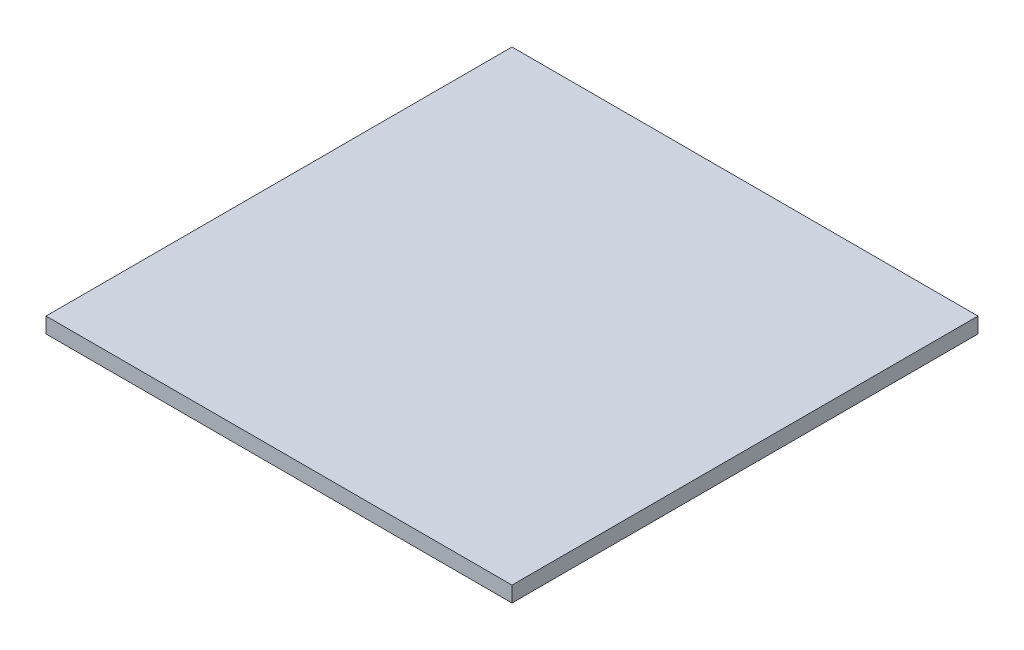
ISO-10303-21;
HEADER;
FILE_DESCRIPTION(('STEP AP214'),'2;1');
FILE_NAME('part.step','',(''),(''),'','','');
FILE_SCHEMA(('AUTOMOTIVE_DESIGN { 1 0 10303 214 1 1 1 1 }'));
ENDSEC;
DATA;
#1=APPLICATION_CONTEXT('core data for automotive mechanical design processes');
#2=APPLICATION_PROTOCOL_DEFINITION('international standard','automotive_design',2000,#1);
#3=PRODUCT_CONTEXT('',#1,'mechanical');
#4=PRODUCT('Part','Part','',(#3));
#5=PRODUCT_RELATED_PRODUCT_CATEGORY('part','',(#4));
#6=PRODUCT_DEFINITION_FORMATION('','',#4);
#7=PRODUCT_DEFINITION_CONTEXT('part definition',#1,'design');
#8=PRODUCT_DEFINITION('design','',#6,#7);
#9=PRODUCT_DEFINITION_SHAPE('','',#8);
#10=(LENGTH_UNIT() NAMED_UNIT(*) SI_UNIT(.MILLI.,.METRE.));
#11=(NAMED_UNIT(*) PLANE_ANGLE_UNIT() SI_UNIT($,.RADIAN.));
#12=(NAMED_UNIT(*) SI_UNIT($,.STERADIAN.) SOLID_ANGLE_UNIT());
#13=UNCERTAINTY_MEASURE_WITH_UNIT(LENGTH_MEASURE(1.E-05),#10,'distance_accuracy_value','');
#14=(GEOMETRIC_REPRESENTATION_CONTEXT(3) GLOBAL_UNCERTAINTY_ASSIGNED_CONTEXT((#13)) GLOBAL_UNIT_ASSIGNED_CONTEXT((#10,
#11,#12)) REPRESENTATION_CONTEXT('',''));
#15=CARTESIAN_POINT('',(0.,0.,0.));
#16=DIRECTION('',(0.,0.,1.));
#17=DIRECTION('',(1.,0.,0.));
#18=AXIS2_PLACEMENT_3D('',#15,#16,#17);
#19=CARTESIAN_POINT('',(0.,10.,0.));
#20=DIRECTION('',(1.,0.,0.));
#21=DIRECTION('',(0.,0.,-1.));
#22=AXIS2_PLACEMENT_3D('',#19,#20,#21);
#23=PLANE('',#22);
#24=DIRECTION('',(0.,0.,1.));
#25=VECTOR('',#24,1.);
#26=CARTESIAN_POINT('',(0.,0.,0.));
#27=LINE('',#26,#25);
#28=CARTESIAN_POINT('',(0.,0.,-300.));
#29=VERTEX_POINT('',#28);
#30=CARTESIAN_POINT('',(0.,0.,0.));
#31=VERTEX_POINT('',#30);
#32=EDGE_CURVE('E115',#29,#31,#27,.T.);
#33=ORIENTED_EDGE('',*,*,#32,.T.);
#34=DIRECTION('',(0.,-1.,0.));
#35=VECTOR('',#34,1.);
#36=CARTESIAN_POINT('',(0.,10.,0.));
#37=LINE('',#36,#35);
#38=CARTESIAN_POINT('',(0.,10.,0.));
#39=VERTEX_POINT('',#38);
#40=EDGE_CURVE('E11',#39,#31,#37,.T.);
#41=ORIENTED_EDGE('',*,*,#40,.F.);
#42=DIRECTION('',(0.,0.,1.));
#43=VECTOR('',#42,1.);
#44=CARTESIAN_POINT('',(0.,10.,0.));
#45=LINE('',#44,#43);
#46=CARTESIAN_POINT('',(0.,10.,-300.));
#47=VERTEX_POINT('',#46);
#48=EDGE_CURVE('E99',#47,#39,#45,.T.);
#49=ORIENTED_EDGE('',*,*,#48,.F.);
#50=DIRECTION('',(0.,-1.,0.));
#51=VECTOR('',#50,1.);
#52=CARTESIAN_POINT('',(0.,10.,-300.));
#53=LINE('',#52,#51);
#54=EDGE_CURVE('E111',#47,#29,#53,.T.);
#55=ORIENTED_EDGE('',*,*,#54,.T.);
#56=EDGE_LOOP('',(#33,#41,#49,#55));
#57=FACE_BOUND('',#56,.T.);
#58=ADVANCED_FACE('F47',(#57),#23,.F.);
#59=CARTESIAN_POINT('',(0.,10.,0.));
#60=DIRECTION('',(0.,0.,-1.));
#61=DIRECTION('',(-1.,0.,0.));
#62=AXIS2_PLACEMENT_3D('',#59,#60,#61);
#63=PLANE('',#62);
#64=DIRECTION('',(1.,0.,0.));
#65=VECTOR('',#64,1.);
#66=CARTESIAN_POINT('',(0.,0.,0.));
#67=LINE('',#66,#65);
#68=CARTESIAN_POINT('',(300.,0.,0.));
#69=VERTEX_POINT('',#68);
#70=EDGE_CURVE('E104',#31,#69,#67,.T.);
#71=ORIENTED_EDGE('',*,*,#70,.T.);
#72=DIRECTION('',(0.,-1.,0.));
#73=VECTOR('',#72,1.);
#74=CARTESIAN_POINT('',(300.,10.,0.));
#75=LINE('',#74,#73);
#76=CARTESIAN_POINT('',(300.,10.,0.));
#77=VERTEX_POINT('',#76);
#78=EDGE_CURVE('E56',#77,#69,#75,.T.);
#79=ORIENTED_EDGE('',*,*,#78,.F.);
#80=DIRECTION('',(1.,0.,0.));
#81=VECTOR('',#80,1.);
#82=CARTESIAN_POINT('',(0.,10.,0.));
#83=LINE('',#82,#81);
#84=EDGE_CURVE('E94',#39,#77,#83,.T.);
#85=ORIENTED_EDGE('',*,*,#84,.F.);
#86=ORIENTED_EDGE('',*,*,#40,.T.);
#87=EDGE_LOOP('',(#71,#79,#85,#86));
#88=FACE_BOUND('',#87,.T.);
#89=ADVANCED_FACE('F103',(#88),#63,.F.);
#90=CARTESIAN_POINT('',(300.,10.,0.));
#91=DIRECTION('',(-1.,0.,0.));
#92=DIRECTION('',(0.,0.,1.));
#93=AXIS2_PLACEMENT_3D('',#90,#91,#92);
#94=PLANE('',#93);
#95=DIRECTION('',(0.,0.,-1.));
#96=VECTOR('',#95,1.);
#97=CARTESIAN_POINT('',(300.,0.,0.));
#98=LINE('',#97,#96);
#99=CARTESIAN_POINT('',(300.,0.,-300.));
#100=VERTEX_POINT('',#99);
#101=EDGE_CURVE('E81',#69,#100,#98,.T.);
#102=ORIENTED_EDGE('',*,*,#101,.T.);
#103=DIRECTION('',(0.,-1.,0.));
#104=VECTOR('',#103,1.);
#105=CARTESIAN_POINT('',(300.,10.,-300.));
#106=LINE('',#105,#104);
#107=CARTESIAN_POINT('',(300.,10.,-300.));
#108=VERTEX_POINT('',#107);
#109=EDGE_CURVE('E106',#108,#100,#106,.T.);
#110=ORIENTED_EDGE('',*,*,#109,.F.);
#111=DIRECTION('',(0.,0.,-1.));
#112=VECTOR('',#111,1.);
#113=CARTESIAN_POINT('',(300.,10.,0.));
#114=LINE('',#113,#112);
#115=EDGE_CURVE('E97',#77,#108,#114,.T.);
#116=ORIENTED_EDGE('',*,*,#115,.F.);
#117=ORIENTED_EDGE('',*,*,#78,.T.);
#118=EDGE_LOOP('',(#102,#110,#116,#117));
#119=FACE_BOUND('',#118,.T.);
#120=ADVANCED_FACE('F107',(#119),#94,.F.);
#121=CARTESIAN_POINT('',(0.,10.,-300.));
#122=DIRECTION('',(0.,0.,1.));
#123=DIRECTION('',(1.,0.,0.));
#124=AXIS2_PLACEMENT_3D('',#121,#122,#123);
#125=PLANE('',#124);
#126=DIRECTION('',(-1.,0.,0.));
#127=VECTOR('',#126,1.);
#128=CARTESIAN_POINT('',(0.,0.,-300.));
#129=LINE('',#128,#127);
#130=EDGE_CURVE('E87',#100,#29,#129,.T.);
#131=ORIENTED_EDGE('',*,*,#130,.T.);
#132=ORIENTED_EDGE('',*,*,#54,.F.);
#133=DIRECTION('',(-1.,0.,0.));
#134=VECTOR('',#133,1.);
#135=CARTESIAN_POINT('',(0.,10.,-300.));
#136=LINE('',#135,#134);
#137=EDGE_CURVE('E64',#108,#47,#136,.T.);
#138=ORIENTED_EDGE('',*,*,#137,.F.);
#139=ORIENTED_EDGE('',*,*,#109,.T.);
#140=EDGE_LOOP('',(#131,#132,#138,#139));
#141=FACE_BOUND('',#140,.T.);
#142=ADVANCED_FACE('F128',(#141),#125,.F.);
#143=CARTESIAN_POINT('',(0.,10.,0.));
#144=DIRECTION('',(0.,-1.,0.));
#145=DIRECTION('',(0.,0.,-1.));
#146=AXIS2_PLACEMENT_3D('',#143,#144,#145);
#147=PLANE('',#146);
#148=ORIENTED_EDGE('',*,*,#48,.T.);
#149=ORIENTED_EDGE('',*,*,#84,.T.);
#150=ORIENTED_EDGE('',*,*,#115,.T.);
#151=ORIENTED_EDGE('',*,*,#137,.T.);
#152=EDGE_LOOP('',(#148,#149,#150,#151));
#153=FACE_BOUND('',#152,.T.);
#154=ADVANCED_FACE('F95',(#153),#147,.F.);
#155=CARTESIAN_POINT('',(0.,0.,0.));
#156=DIRECTION('',(0.,-1.,0.));
#157=DIRECTION('',(0.,0.,-1.));
#158=AXIS2_PLACEMENT_3D('',#155,#156,#157);
#159=PLANE('',#158);
#160=ORIENTED_EDGE('',*,*,#32,.F.);
#161=ORIENTED_EDGE('',*,*,#130,.F.);
#162=ORIENTED_EDGE('',*,*,#101,.F.);
#163=ORIENTED_EDGE('',*,*,#70,.F.);
#164=EDGE_LOOP('',(#160,#161,#162,#163));
#165=FACE_BOUND('',#164,.T.);
#166=ADVANCED_FACE('F131',(#165),#159,.T.);
#167=CLOSED_SHELL('',(#58,#89,#120,#142,#154,#166));
#168=MANIFOLD_SOLID_BREP('B2',#167);
#169=ADVANCED_BREP_SHAPE_REPRESENTATION('',(#18,#168),#14);
#170=SHAPE_DEFINITION_REPRESENTATION(#9,#169);
ENDSEC;
END-ISO-10303-21;
